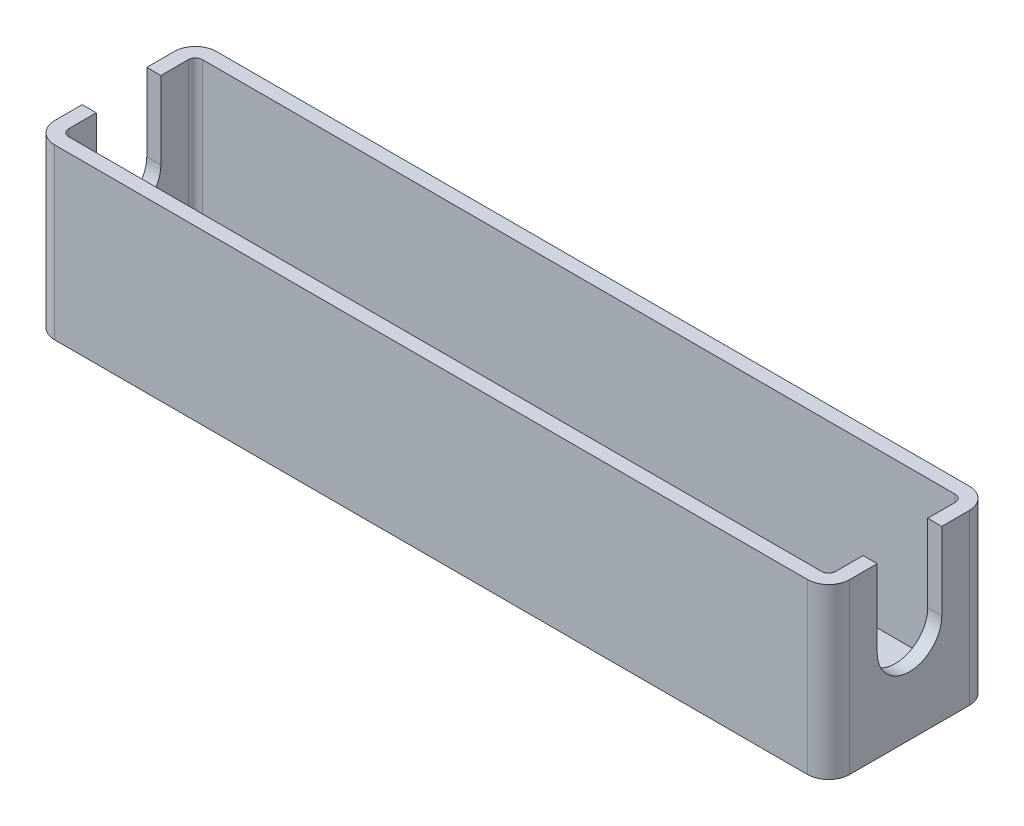
ISO-10303-21;
HEADER;
FILE_DESCRIPTION(('STEP AP214'),'2;1');
FILE_NAME('part.step','',(''),(''),'','','');
FILE_SCHEMA(('AUTOMOTIVE_DESIGN { 1 0 10303 214 1 1 1 1 }'));
ENDSEC;
DATA;
#1=APPLICATION_CONTEXT('core data for automotive mechanical design processes');
#2=APPLICATION_PROTOCOL_DEFINITION('international standard','automotive_design',2000,#1);
#3=PRODUCT_CONTEXT('',#1,'mechanical');
#4=PRODUCT('Part','Part','',(#3));
#5=PRODUCT_RELATED_PRODUCT_CATEGORY('part','',(#4));
#6=PRODUCT_DEFINITION_FORMATION('','',#4);
#7=PRODUCT_DEFINITION_CONTEXT('part definition',#1,'design');
#8=PRODUCT_DEFINITION('design','',#6,#7);
#9=PRODUCT_DEFINITION_SHAPE('','',#8);
#10=(LENGTH_UNIT() NAMED_UNIT(*) SI_UNIT(.MILLI.,.METRE.));
#11=(NAMED_UNIT(*) PLANE_ANGLE_UNIT() SI_UNIT($,.RADIAN.));
#12=(NAMED_UNIT(*) SI_UNIT($,.STERADIAN.) SOLID_ANGLE_UNIT());
#13=UNCERTAINTY_MEASURE_WITH_UNIT(LENGTH_MEASURE(1.E-05),#10,'distance_accuracy_value','');
#14=(GEOMETRIC_REPRESENTATION_CONTEXT(3) GLOBAL_UNCERTAINTY_ASSIGNED_CONTEXT((#13)) GLOBAL_UNIT_ASSIGNED_CONTEXT((#10,
#11,#12)) REPRESENTATION_CONTEXT('',''));
#15=CARTESIAN_POINT('',(0.,0.,0.));
#16=DIRECTION('',(0.,0.,1.));
#17=DIRECTION('',(1.,0.,0.));
#18=AXIS2_PLACEMENT_3D('',#15,#16,#17);
#19=CARTESIAN_POINT('',(-53.5,24.,-8.5));
#20=DIRECTION('',(0.,-1.,0.));
#21=DIRECTION('',(0.,0.,-1.));
#22=AXIS2_PLACEMENT_3D('',#19,#20,#21);
#23=PLANE('',#22);
#24=DIRECTION('',(0.,0.,1.));
#25=VECTOR('',#24,1.);
#26=CARTESIAN_POINT('',(-56.5,24.,8.49999999999998));
#27=LINE('',#26,#25);
#28=CARTESIAN_POINT('',(-56.5,24.,-8.49999999999998));
#29=VERTEX_POINT('',#28);
#30=CARTESIAN_POINT('',(-56.5,24.,-4.58880441680698));
#31=VERTEX_POINT('',#30);
#32=EDGE_CURVE('E231',#29,#31,#27,.T.);
#33=ORIENTED_EDGE('',*,*,#32,.T.);
#34=DIRECTION('',(1.,0.,0.));
#35=VECTOR('',#34,1.);
#36=CARTESIAN_POINT('',(-56.5,24.,-4.58880441680698));
#37=LINE('',#36,#35);
#38=CARTESIAN_POINT('',(-54.5,24.,-4.58880441680698));
#39=VERTEX_POINT('',#38);
#40=EDGE_CURVE('E350',#31,#39,#37,.T.);
#41=ORIENTED_EDGE('',*,*,#40,.T.);
#42=DIRECTION('',(0.,0.,1.));
#43=VECTOR('',#42,1.);
#44=CARTESIAN_POINT('',(-54.5,24.,-8.5));
#45=LINE('',#44,#43);
#46=CARTESIAN_POINT('',(-54.5,24.,-8.49999999999998));
#47=VERTEX_POINT('',#46);
#48=EDGE_CURVE('E416',#47,#39,#45,.T.);
#49=ORIENTED_EDGE('',*,*,#48,.F.);
#50=CARTESIAN_POINT('',(-53.5,24.,-8.5));
#51=DIRECTION('',(0.,-1.,0.));
#52=DIRECTION('',(0.,0.,-1.));
#53=AXIS2_PLACEMENT_3D('',#50,#51,#52);
#54=CIRCLE('',#53,1.);
#55=CARTESIAN_POINT('',(-53.5,24.,-9.5));
#56=VERTEX_POINT('',#55);
#57=EDGE_CURVE('E413',#56,#47,#54,.F.);
#58=ORIENTED_EDGE('',*,*,#57,.F.);
#59=DIRECTION('',(-1.,0.,0.));
#60=VECTOR('',#59,1.);
#61=CARTESIAN_POINT('',(-53.5,24.,-9.5));
#62=LINE('',#61,#60);
#63=CARTESIAN_POINT('',(53.5,24.,-9.50000000000001));
#64=VERTEX_POINT('',#63);
#65=EDGE_CURVE('E370',#64,#56,#62,.T.);
#66=ORIENTED_EDGE('',*,*,#65,.F.);
#67=CARTESIAN_POINT('',(53.5,24.,-8.5));
#68=DIRECTION('',(0.,-1.,0.));
#69=DIRECTION('',(0.,0.,-1.));
#70=AXIS2_PLACEMENT_3D('',#67,#68,#69);
#71=CIRCLE('',#70,1.);
#72=CARTESIAN_POINT('',(54.5,24.,-8.49999999999999));
#73=VERTEX_POINT('',#72);
#74=EDGE_CURVE('E432',#73,#64,#71,.F.);
#75=ORIENTED_EDGE('',*,*,#74,.F.);
#76=DIRECTION('',(0.,0.,-1.));
#77=VECTOR('',#76,1.);
#78=CARTESIAN_POINT('',(54.5,24.,-8.5));
#79=LINE('',#78,#77);
#80=CARTESIAN_POINT('',(54.5,24.,-4.58880441680698));
#81=VERTEX_POINT('',#80);
#82=EDGE_CURVE('E429',#81,#73,#79,.T.);
#83=ORIENTED_EDGE('',*,*,#82,.F.);
#84=CARTESIAN_POINT('',(56.5,24.,-4.58880441680698));
#85=VERTEX_POINT('',#84);
#86=EDGE_CURVE('E463',#81,#85,#37,.T.);
#87=ORIENTED_EDGE('',*,*,#86,.T.);
#88=DIRECTION('',(0.,0.,-1.));
#89=VECTOR('',#88,1.);
#90=CARTESIAN_POINT('',(56.5,24.,8.49999999999998));
#91=LINE('',#90,#89);
#92=CARTESIAN_POINT('',(56.5,24.,-8.49999999999998));
#93=VERTEX_POINT('',#92);
#94=EDGE_CURVE('E251',#85,#93,#91,.T.);
#95=ORIENTED_EDGE('',*,*,#94,.T.);
#96=CARTESIAN_POINT('',(53.5,24.,-8.5));
#97=DIRECTION('',(0.,1.,0.));
#98=DIRECTION('',(0.,0.,-1.));
#99=AXIS2_PLACEMENT_3D('',#96,#97,#98);
#100=CIRCLE('',#99,3.);
#101=CARTESIAN_POINT('',(53.5,24.,-11.5));
#102=VERTEX_POINT('',#101);
#103=EDGE_CURVE('E255',#93,#102,#100,.T.);
#104=ORIENTED_EDGE('',*,*,#103,.T.);
#105=DIRECTION('',(-1.,0.,0.));
#106=VECTOR('',#105,1.);
#107=CARTESIAN_POINT('',(-53.5,24.,-11.5));
#108=LINE('',#107,#106);
#109=CARTESIAN_POINT('',(-53.5,24.,-11.5));
#110=VERTEX_POINT('',#109);
#111=EDGE_CURVE('E258',#102,#110,#108,.T.);
#112=ORIENTED_EDGE('',*,*,#111,.T.);
#113=CARTESIAN_POINT('',(-53.5,24.,-8.5));
#114=DIRECTION('',(0.,1.,0.));
#115=DIRECTION('',(0.,0.,-1.));
#116=AXIS2_PLACEMENT_3D('',#113,#114,#115);
#117=CIRCLE('',#116,3.);
#118=EDGE_CURVE('E232',#110,#29,#117,.T.);
#119=ORIENTED_EDGE('',*,*,#118,.T.);
#120=EDGE_LOOP('',(#33,#41,#49,#58,#66,#75,#83,#87,#95,#104,#112,#119));
#121=FACE_BOUND('',#120,.T.);
#122=ADVANCED_FACE('F44',(#121),#23,.F.);
#123=CARTESIAN_POINT('',(56.5,24.,8.49999999999998));
#124=VERTEX_POINT('',#123);
#125=CARTESIAN_POINT('',(56.5,24.,4.58880441680698));
#126=VERTEX_POINT('',#125);
#127=EDGE_CURVE('E252',#124,#126,#91,.T.);
#128=ORIENTED_EDGE('',*,*,#127,.T.);
#129=DIRECTION('',(1.,0.,0.));
#130=VECTOR('',#129,1.);
#131=CARTESIAN_POINT('',(-56.5,24.,4.58880441680698));
#132=LINE('',#131,#130);
#133=CARTESIAN_POINT('',(54.5,24.,4.58880441680698));
#134=VERTEX_POINT('',#133);
#135=EDGE_CURVE('E224',#134,#126,#132,.T.);
#136=ORIENTED_EDGE('',*,*,#135,.F.);
#137=CARTESIAN_POINT('',(54.5,24.,8.49999999999999));
#138=VERTEX_POINT('',#137);
#139=EDGE_CURVE('E332',#138,#134,#79,.T.);
#140=ORIENTED_EDGE('',*,*,#139,.F.);
#141=CARTESIAN_POINT('',(53.5,24.,8.5));
#142=DIRECTION('',(0.,-1.,0.));
#143=DIRECTION('',(0.,0.,-1.));
#144=AXIS2_PLACEMENT_3D('',#141,#142,#143);
#145=CIRCLE('',#144,1.);
#146=CARTESIAN_POINT('',(53.5,24.,9.5));
#147=VERTEX_POINT('',#146);
#148=EDGE_CURVE('E426',#147,#138,#145,.F.);
#149=ORIENTED_EDGE('',*,*,#148,.F.);
#150=DIRECTION('',(1.,0.,0.));
#151=VECTOR('',#150,1.);
#152=CARTESIAN_POINT('',(-53.5,24.,9.5));
#153=LINE('',#152,#151);
#154=CARTESIAN_POINT('',(-53.5,24.,9.5));
#155=VERTEX_POINT('',#154);
#156=EDGE_CURVE('E423',#155,#147,#153,.T.);
#157=ORIENTED_EDGE('',*,*,#156,.F.);
#158=CARTESIAN_POINT('',(-53.5,24.,8.5));
#159=DIRECTION('',(0.,-1.,0.));
#160=DIRECTION('',(0.,0.,-1.));
#161=AXIS2_PLACEMENT_3D('',#158,#159,#160);
#162=CIRCLE('',#161,1.);
#163=CARTESIAN_POINT('',(-54.5,24.,8.49999999999998));
#164=VERTEX_POINT('',#163);
#165=EDGE_CURVE('E420',#164,#155,#162,.F.);
#166=ORIENTED_EDGE('',*,*,#165,.F.);
#167=CARTESIAN_POINT('',(-54.5,24.,4.58880441680698));
#168=VERTEX_POINT('',#167);
#169=EDGE_CURVE('E222',#168,#164,#45,.T.);
#170=ORIENTED_EDGE('',*,*,#169,.F.);
#171=CARTESIAN_POINT('',(-56.5,24.,4.58880441680698));
#172=VERTEX_POINT('',#171);
#173=EDGE_CURVE('E60',#172,#168,#132,.T.);
#174=ORIENTED_EDGE('',*,*,#173,.F.);
#175=CARTESIAN_POINT('',(-56.5,24.,8.49999999999998));
#176=VERTEX_POINT('',#175);
#177=EDGE_CURVE('E219',#172,#176,#27,.T.);
#178=ORIENTED_EDGE('',*,*,#177,.T.);
#179=CARTESIAN_POINT('',(-53.5,24.,8.5));
#180=DIRECTION('',(0.,1.,0.));
#181=DIRECTION('',(0.,0.,-1.));
#182=AXIS2_PLACEMENT_3D('',#179,#180,#181);
#183=CIRCLE('',#182,3.);
#184=CARTESIAN_POINT('',(-53.5,24.,11.5));
#185=VERTEX_POINT('',#184);
#186=EDGE_CURVE('E237',#176,#185,#183,.T.);
#187=ORIENTED_EDGE('',*,*,#186,.T.);
#188=DIRECTION('',(1.,0.,0.));
#189=VECTOR('',#188,1.);
#190=CARTESIAN_POINT('',(-53.5,24.,11.5));
#191=LINE('',#190,#189);
#192=CARTESIAN_POINT('',(53.5,24.,11.5));
#193=VERTEX_POINT('',#192);
#194=EDGE_CURVE('E245',#185,#193,#191,.T.);
#195=ORIENTED_EDGE('',*,*,#194,.T.);
#196=CARTESIAN_POINT('',(53.5,24.,8.5));
#197=DIRECTION('',(0.,1.,0.));
#198=DIRECTION('',(0.,0.,1.));
#199=AXIS2_PLACEMENT_3D('',#196,#197,#198);
#200=CIRCLE('',#199,3.);
#201=EDGE_CURVE('E248',#193,#124,#200,.T.);
#202=ORIENTED_EDGE('',*,*,#201,.T.);
#203=EDGE_LOOP('',(#128,#136,#140,#149,#157,#166,#170,#174,#178,#187,#195,#202));
#204=FACE_BOUND('',#203,.T.);
#205=ADVANCED_FACE('F218',(#204),#23,.F.);
#206=CARTESIAN_POINT('',(-53.5,24.,-8.5));
#207=DIRECTION('',(0.,-1.,0.));
#208=DIRECTION('',(0.,0.,-1.));
#209=AXIS2_PLACEMENT_3D('',#206,#207,#208);
#210=CYLINDRICAL_SURFACE('',#209,3.);
#211=CARTESIAN_POINT('',(-53.5,0.,-8.5));
#212=DIRECTION('',(0.,1.,0.));
#213=DIRECTION('',(0.,0.,-1.));
#214=AXIS2_PLACEMENT_3D('',#211,#212,#213);
#215=CIRCLE('',#214,3.);
#216=CARTESIAN_POINT('',(-53.5,0.,-11.5));
#217=VERTEX_POINT('',#216);
#218=CARTESIAN_POINT('',(-56.5,0.,-8.49999999999998));
#219=VERTEX_POINT('',#218);
#220=EDGE_CURVE('E262',#217,#219,#215,.T.);
#221=ORIENTED_EDGE('',*,*,#220,.T.);
#222=DIRECTION('',(0.,-1.,0.));
#223=VECTOR('',#222,1.);
#224=CARTESIAN_POINT('',(-56.5,24.,-8.49999999999998));
#225=LINE('',#224,#223);
#226=EDGE_CURVE('E312',#29,#219,#225,.T.);
#227=ORIENTED_EDGE('',*,*,#226,.F.);
#228=ORIENTED_EDGE('',*,*,#118,.F.);
#229=DIRECTION('',(0.,-1.,0.));
#230=VECTOR('',#229,1.);
#231=CARTESIAN_POINT('',(-53.5,24.,-11.5));
#232=LINE('',#231,#230);
#233=EDGE_CURVE('E261',#110,#217,#232,.T.);
#234=ORIENTED_EDGE('',*,*,#233,.T.);
#235=EDGE_LOOP('',(#221,#227,#228,#234));
#236=FACE_BOUND('',#235,.T.);
#237=ADVANCED_FACE('F46',(#236),#210,.T.);
#238=CARTESIAN_POINT('',(-56.5,24.,8.49999999999998));
#239=DIRECTION('',(1.,0.,0.));
#240=DIRECTION('',(0.,0.,-1.));
#241=AXIS2_PLACEMENT_3D('',#238,#239,#240);
#242=PLANE('',#241);
#243=CARTESIAN_POINT('',(-56.5,13.,0.));
#244=DIRECTION('',(1.,0.,0.));
#245=DIRECTION('',(0.,0.,-1.));
#246=AXIS2_PLACEMENT_3D('',#243,#244,#245);
#247=CIRCLE('',#246,4.58880441680698);
#248=CARTESIAN_POINT('',(-56.5,13.,4.58880441680698));
#249=VERTEX_POINT('',#248);
#250=CARTESIAN_POINT('',(-56.5,13.,-4.58880441680698));
#251=VERTEX_POINT('',#250);
#252=EDGE_CURVE('E212',#249,#251,#247,.T.);
#253=ORIENTED_EDGE('',*,*,#252,.T.);
#254=DIRECTION('',(0.,1.,0.));
#255=VECTOR('',#254,1.);
#256=CARTESIAN_POINT('',(-56.5,13.,-4.58880441680699));
#257=LINE('',#256,#255);
#258=EDGE_CURVE('E339',#251,#31,#257,.T.);
#259=ORIENTED_EDGE('',*,*,#258,.T.);
#260=ORIENTED_EDGE('',*,*,#32,.F.);
#261=ORIENTED_EDGE('',*,*,#226,.T.);
#262=DIRECTION('',(0.,0.,1.));
#263=VECTOR('',#262,1.);
#264=CARTESIAN_POINT('',(-56.5,0.,8.49999999999998));
#265=LINE('',#264,#263);
#266=CARTESIAN_POINT('',(-56.5,0.,8.49999999999998));
#267=VERTEX_POINT('',#266);
#268=EDGE_CURVE('E266',#219,#267,#265,.T.);
#269=ORIENTED_EDGE('',*,*,#268,.T.);
#270=DIRECTION('',(0.,-1.,0.));
#271=VECTOR('',#270,1.);
#272=CARTESIAN_POINT('',(-56.5,24.,8.49999999999998));
#273=LINE('',#272,#271);
#274=EDGE_CURVE('E228',#176,#267,#273,.T.);
#275=ORIENTED_EDGE('',*,*,#274,.F.);
#276=ORIENTED_EDGE('',*,*,#177,.F.);
#277=DIRECTION('',(0.,-1.,0.));
#278=VECTOR('',#277,1.);
#279=CARTESIAN_POINT('',(-56.5,24.,4.58880441680698));
#280=LINE('',#279,#278);
#281=EDGE_CURVE('E203',#172,#249,#280,.T.);
#282=ORIENTED_EDGE('',*,*,#281,.T.);
#283=EDGE_LOOP('',(#253,#259,#260,#261,#269,#275,#276,#282));
#284=FACE_BOUND('',#283,.T.);
#285=ADVANCED_FACE('F226',(#284),#242,.F.);
#286=CARTESIAN_POINT('',(-53.5,24.,8.5));
#287=DIRECTION('',(0.,-1.,0.));
#288=DIRECTION('',(0.,0.,-1.));
#289=AXIS2_PLACEMENT_3D('',#286,#287,#288);
#290=CYLINDRICAL_SURFACE('',#289,3.);
#291=CARTESIAN_POINT('',(-53.5,0.,8.5));
#292=DIRECTION('',(0.,1.,0.));
#293=DIRECTION('',(0.,0.,-1.));
#294=AXIS2_PLACEMENT_3D('',#291,#292,#293);
#295=CIRCLE('',#294,3.);
#296=CARTESIAN_POINT('',(-53.5,0.,11.5));
#297=VERTEX_POINT('',#296);
#298=EDGE_CURVE('E270',#267,#297,#295,.T.);
#299=ORIENTED_EDGE('',*,*,#298,.T.);
#300=DIRECTION('',(0.,-1.,0.));
#301=VECTOR('',#300,1.);
#302=CARTESIAN_POINT('',(-53.5,24.,11.5));
#303=LINE('',#302,#301);
#304=EDGE_CURVE('E306',#185,#297,#303,.T.);
#305=ORIENTED_EDGE('',*,*,#304,.F.);
#306=ORIENTED_EDGE('',*,*,#186,.F.);
#307=ORIENTED_EDGE('',*,*,#274,.T.);
#308=EDGE_LOOP('',(#299,#305,#306,#307));
#309=FACE_BOUND('',#308,.T.);
#310=ADVANCED_FACE('F532',(#309),#290,.T.);
#311=CARTESIAN_POINT('',(-53.5,24.,11.5));
#312=DIRECTION('',(0.,0.,-1.));
#313=DIRECTION('',(-1.,0.,0.));
#314=AXIS2_PLACEMENT_3D('',#311,#312,#313);
#315=PLANE('',#314);
#316=DIRECTION('',(1.,0.,0.));
#317=VECTOR('',#316,1.);
#318=CARTESIAN_POINT('',(-53.5,0.,11.5));
#319=LINE('',#318,#317);
#320=CARTESIAN_POINT('',(53.5,0.,11.5));
#321=VERTEX_POINT('',#320);
#322=EDGE_CURVE('E273',#297,#321,#319,.T.);
#323=ORIENTED_EDGE('',*,*,#322,.T.);
#324=DIRECTION('',(0.,-1.,0.));
#325=VECTOR('',#324,1.);
#326=CARTESIAN_POINT('',(53.5,24.,11.5));
#327=LINE('',#326,#325);
#328=EDGE_CURVE('E302',#193,#321,#327,.T.);
#329=ORIENTED_EDGE('',*,*,#328,.F.);
#330=ORIENTED_EDGE('',*,*,#194,.F.);
#331=ORIENTED_EDGE('',*,*,#304,.T.);
#332=EDGE_LOOP('',(#323,#329,#330,#331));
#333=FACE_BOUND('',#332,.T.);
#334=ADVANCED_FACE('F528',(#333),#315,.F.);
#335=CARTESIAN_POINT('',(53.5,24.,8.5));
#336=DIRECTION('',(0.,-1.,0.));
#337=DIRECTION('',(0.,0.,-1.));
#338=AXIS2_PLACEMENT_3D('',#335,#336,#337);
#339=CYLINDRICAL_SURFACE('',#338,3.);
#340=CARTESIAN_POINT('',(53.5,0.,8.5));
#341=DIRECTION('',(0.,1.,0.));
#342=DIRECTION('',(0.,0.,1.));
#343=AXIS2_PLACEMENT_3D('',#340,#341,#342);
#344=CIRCLE('',#343,3.);
#345=CARTESIAN_POINT('',(56.5,0.,8.49999999999998));
#346=VERTEX_POINT('',#345);
#347=EDGE_CURVE('E276',#321,#346,#344,.T.);
#348=ORIENTED_EDGE('',*,*,#347,.T.);
#349=DIRECTION('',(0.,-1.,0.));
#350=VECTOR('',#349,1.);
#351=CARTESIAN_POINT('',(56.5,24.,8.49999999999998));
#352=LINE('',#351,#350);
#353=EDGE_CURVE('E298',#124,#346,#352,.T.);
#354=ORIENTED_EDGE('',*,*,#353,.F.);
#355=ORIENTED_EDGE('',*,*,#201,.F.);
#356=ORIENTED_EDGE('',*,*,#328,.T.);
#357=EDGE_LOOP('',(#348,#354,#355,#356));
#358=FACE_BOUND('',#357,.T.);
#359=ADVANCED_FACE('F524',(#358),#339,.T.);
#360=CARTESIAN_POINT('',(56.5,24.,8.49999999999998));
#361=DIRECTION('',(-1.,0.,0.));
#362=DIRECTION('',(0.,0.,1.));
#363=AXIS2_PLACEMENT_3D('',#360,#361,#362);
#364=PLANE('',#363);
#365=ORIENTED_EDGE('',*,*,#94,.F.);
#366=DIRECTION('',(0.,1.,0.));
#367=VECTOR('',#366,1.);
#368=CARTESIAN_POINT('',(56.5,13.,-4.58880441680699));
#369=LINE('',#368,#367);
#370=CARTESIAN_POINT('',(56.5,13.,-4.58880441680698));
#371=VERTEX_POINT('',#370);
#372=EDGE_CURVE('E213',#371,#85,#369,.T.);
#373=ORIENTED_EDGE('',*,*,#372,.F.);
#374=CARTESIAN_POINT('',(56.5,13.,0.));
#375=DIRECTION('',(1.,0.,0.));
#376=DIRECTION('',(0.,0.,-1.));
#377=AXIS2_PLACEMENT_3D('',#374,#375,#376);
#378=CIRCLE('',#377,4.58880441680698);
#379=CARTESIAN_POINT('',(56.5,13.,4.58880441680698));
#380=VERTEX_POINT('',#379);
#381=EDGE_CURVE('E566',#380,#371,#378,.T.);
#382=ORIENTED_EDGE('',*,*,#381,.F.);
#383=DIRECTION('',(0.,-1.,0.));
#384=VECTOR('',#383,1.);
#385=CARTESIAN_POINT('',(56.5,24.,4.58880441680698));
#386=LINE('',#385,#384);
#387=EDGE_CURVE('E564',#126,#380,#386,.T.);
#388=ORIENTED_EDGE('',*,*,#387,.F.);
#389=ORIENTED_EDGE('',*,*,#127,.F.);
#390=ORIENTED_EDGE('',*,*,#353,.T.);
#391=DIRECTION('',(0.,0.,-1.));
#392=VECTOR('',#391,1.);
#393=CARTESIAN_POINT('',(56.5,0.,8.49999999999998));
#394=LINE('',#393,#392);
#395=CARTESIAN_POINT('',(56.5,0.,-8.49999999999998));
#396=VERTEX_POINT('',#395);
#397=EDGE_CURVE('E279',#346,#396,#394,.T.);
#398=ORIENTED_EDGE('',*,*,#397,.T.);
#399=DIRECTION('',(0.,-1.,0.));
#400=VECTOR('',#399,1.);
#401=CARTESIAN_POINT('',(56.5,24.,-8.49999999999998));
#402=LINE('',#401,#400);
#403=EDGE_CURVE('E294',#93,#396,#402,.T.);
#404=ORIENTED_EDGE('',*,*,#403,.F.);
#405=EDGE_LOOP('',(#365,#373,#382,#388,#389,#390,#398,#404));
#406=FACE_BOUND('',#405,.T.);
#407=ADVANCED_FACE('F520',(#406),#364,.F.);
#408=CARTESIAN_POINT('',(53.5,24.,-8.5));
#409=DIRECTION('',(0.,-1.,0.));
#410=DIRECTION('',(0.,0.,-1.));
#411=AXIS2_PLACEMENT_3D('',#408,#409,#410);
#412=CYLINDRICAL_SURFACE('',#411,3.);
#413=CARTESIAN_POINT('',(53.5,0.,-8.5));
#414=DIRECTION('',(0.,1.,0.));
#415=DIRECTION('',(0.,0.,-1.));
#416=AXIS2_PLACEMENT_3D('',#413,#414,#415);
#417=CIRCLE('',#416,3.);
#418=CARTESIAN_POINT('',(53.5,0.,-11.5));
#419=VERTEX_POINT('',#418);
#420=EDGE_CURVE('E282',#396,#419,#417,.T.);
#421=ORIENTED_EDGE('',*,*,#420,.T.);
#422=DIRECTION('',(0.,-1.,0.));
#423=VECTOR('',#422,1.);
#424=CARTESIAN_POINT('',(53.5,24.,-11.5));
#425=LINE('',#424,#423);
#426=EDGE_CURVE('E290',#102,#419,#425,.T.);
#427=ORIENTED_EDGE('',*,*,#426,.F.);
#428=ORIENTED_EDGE('',*,*,#103,.F.);
#429=ORIENTED_EDGE('',*,*,#403,.T.);
#430=EDGE_LOOP('',(#421,#427,#428,#429));
#431=FACE_BOUND('',#430,.T.);
#432=ADVANCED_FACE('F516',(#431),#412,.T.);
#433=CARTESIAN_POINT('',(-53.5,24.,-11.5));
#434=DIRECTION('',(0.,0.,1.));
#435=DIRECTION('',(1.,0.,0.));
#436=AXIS2_PLACEMENT_3D('',#433,#434,#435);
#437=PLANE('',#436);
#438=DIRECTION('',(-1.,0.,0.));
#439=VECTOR('',#438,1.);
#440=CARTESIAN_POINT('',(-53.5,0.,-11.5));
#441=LINE('',#440,#439);
#442=EDGE_CURVE('E239',#419,#217,#441,.T.);
#443=ORIENTED_EDGE('',*,*,#442,.T.);
#444=ORIENTED_EDGE('',*,*,#233,.F.);
#445=ORIENTED_EDGE('',*,*,#111,.F.);
#446=ORIENTED_EDGE('',*,*,#426,.T.);
#447=EDGE_LOOP('',(#443,#444,#445,#446));
#448=FACE_BOUND('',#447,.T.);
#449=ADVANCED_FACE('F512',(#448),#437,.F.);
#450=CARTESIAN_POINT('',(-53.5,0.,-8.5));
#451=DIRECTION('',(0.,-1.,0.));
#452=DIRECTION('',(0.,0.,-1.));
#453=AXIS2_PLACEMENT_3D('',#450,#451,#452);
#454=PLANE('',#453);
#455=ORIENTED_EDGE('',*,*,#220,.F.);
#456=ORIENTED_EDGE('',*,*,#442,.F.);
#457=ORIENTED_EDGE('',*,*,#420,.F.);
#458=ORIENTED_EDGE('',*,*,#397,.F.);
#459=ORIENTED_EDGE('',*,*,#347,.F.);
#460=ORIENTED_EDGE('',*,*,#322,.F.);
#461=ORIENTED_EDGE('',*,*,#298,.F.);
#462=ORIENTED_EDGE('',*,*,#268,.F.);
#463=EDGE_LOOP('',(#455,#456,#457,#458,#459,#460,#461,#462));
#464=FACE_BOUND('',#463,.T.);
#465=ADVANCED_FACE('F509',(#464),#454,.T.);
#466=CARTESIAN_POINT('',(-53.5,24.,-8.5));
#467=DIRECTION('',(0.,-1.,0.));
#468=DIRECTION('',(0.,0.,-1.));
#469=AXIS2_PLACEMENT_3D('',#466,#467,#468);
#470=CYLINDRICAL_SURFACE('',#469,1.);
#471=CARTESIAN_POINT('',(-53.5,2.,-8.5));
#472=DIRECTION('',(0.,-1.,0.));
#473=DIRECTION('',(0.,0.,-1.));
#474=AXIS2_PLACEMENT_3D('',#471,#472,#473);
#475=CIRCLE('',#474,1.);
#476=CARTESIAN_POINT('',(-53.5,2.,-9.50000000000001));
#477=VERTEX_POINT('',#476);
#478=CARTESIAN_POINT('',(-54.5,2.,-8.49999999999998));
#479=VERTEX_POINT('',#478);
#480=EDGE_CURVE('E356',#477,#479,#475,.F.);
#481=ORIENTED_EDGE('',*,*,#480,.F.);
#482=DIRECTION('',(0.,-1.,0.));
#483=VECTOR('',#482,1.);
#484=CARTESIAN_POINT('',(-53.5,24.,-9.50000000000001));
#485=LINE('',#484,#483);
#486=EDGE_CURVE('E365',#56,#477,#485,.T.);
#487=ORIENTED_EDGE('',*,*,#486,.F.);
#488=ORIENTED_EDGE('',*,*,#57,.T.);
#489=DIRECTION('',(0.,1.,0.));
#490=VECTOR('',#489,1.);
#491=CARTESIAN_POINT('',(-54.5,24.,-8.49999999999998));
#492=LINE('',#491,#490);
#493=EDGE_CURVE('E267',#47,#479,#492,.F.);
#494=ORIENTED_EDGE('',*,*,#493,.T.);
#495=EDGE_LOOP('',(#481,#487,#488,#494));
#496=FACE_BOUND('',#495,.T.);
#497=ADVANCED_FACE('F446',(#496),#470,.F.);
#498=CARTESIAN_POINT('',(-54.5,24.,8.49999999999998));
#499=DIRECTION('',(1.,0.,0.));
#500=DIRECTION('',(0.,0.,-1.));
#501=AXIS2_PLACEMENT_3D('',#498,#499,#500);
#502=PLANE('',#501);
#503=DIRECTION('',(0.,1.,0.));
#504=VECTOR('',#503,1.);
#505=CARTESIAN_POINT('',(-54.5,24.,-4.58880441680698));
#506=LINE('',#505,#504);
#507=CARTESIAN_POINT('',(-54.5,13.,-4.58880441680698));
#508=VERTEX_POINT('',#507);
#509=EDGE_CURVE('E353',#508,#39,#506,.T.);
#510=ORIENTED_EDGE('',*,*,#509,.F.);
#511=CARTESIAN_POINT('',(-54.5,13.,0.));
#512=DIRECTION('',(1.,0.,0.));
#513=DIRECTION('',(0.,0.,-1.));
#514=AXIS2_PLACEMENT_3D('',#511,#512,#513);
#515=CIRCLE('',#514,4.58880441680698);
#516=CARTESIAN_POINT('',(-54.5,13.,4.58880441680698));
#517=VERTEX_POINT('',#516);
#518=EDGE_CURVE('E349',#517,#508,#515,.T.);
#519=ORIENTED_EDGE('',*,*,#518,.F.);
#520=DIRECTION('',(0.,-1.,0.));
#521=VECTOR('',#520,1.);
#522=CARTESIAN_POINT('',(-54.5,24.,4.58880441680698));
#523=LINE('',#522,#521);
#524=EDGE_CURVE('E346',#168,#517,#523,.T.);
#525=ORIENTED_EDGE('',*,*,#524,.F.);
#526=ORIENTED_EDGE('',*,*,#169,.T.);
#527=DIRECTION('',(0.,-1.,0.));
#528=VECTOR('',#527,1.);
#529=CARTESIAN_POINT('',(-54.5,24.,8.49999999999999));
#530=LINE('',#529,#528);
#531=CARTESIAN_POINT('',(-54.5,2.,8.49999999999999));
#532=VERTEX_POINT('',#531);
#533=EDGE_CURVE('E364',#164,#532,#530,.T.);
#534=ORIENTED_EDGE('',*,*,#533,.T.);
#535=DIRECTION('',(0.,0.,1.));
#536=VECTOR('',#535,1.);
#537=CARTESIAN_POINT('',(-54.5,2.,-8.5));
#538=LINE('',#537,#536);
#539=EDGE_CURVE('E360',#479,#532,#538,.T.);
#540=ORIENTED_EDGE('',*,*,#539,.F.);
#541=ORIENTED_EDGE('',*,*,#493,.F.);
#542=ORIENTED_EDGE('',*,*,#48,.T.);
#543=EDGE_LOOP('',(#510,#519,#525,#526,#534,#540,#541,#542));
#544=FACE_BOUND('',#543,.T.);
#545=ADVANCED_FACE('F452',(#544),#502,.T.);
#546=CARTESIAN_POINT('',(-53.5,24.,8.5));
#547=DIRECTION('',(0.,-1.,0.));
#548=DIRECTION('',(0.,0.,-1.));
#549=AXIS2_PLACEMENT_3D('',#546,#547,#548);
#550=CYLINDRICAL_SURFACE('',#549,1.);
#551=CARTESIAN_POINT('',(-53.5,2.,8.5));
#552=DIRECTION('',(0.,-1.,0.));
#553=DIRECTION('',(0.,0.,-1.));
#554=AXIS2_PLACEMENT_3D('',#551,#552,#553);
#555=CIRCLE('',#554,1.);
#556=CARTESIAN_POINT('',(-53.5,2.,9.5));
#557=VERTEX_POINT('',#556);
#558=EDGE_CURVE('E373',#532,#557,#555,.F.);
#559=ORIENTED_EDGE('',*,*,#558,.F.);
#560=ORIENTED_EDGE('',*,*,#533,.F.);
#561=ORIENTED_EDGE('',*,*,#165,.T.);
#562=DIRECTION('',(0.,1.,0.));
#563=VECTOR('',#562,1.);
#564=CARTESIAN_POINT('',(-53.5,24.,9.5));
#565=LINE('',#564,#563);
#566=EDGE_CURVE('E377',#155,#557,#565,.F.);
#567=ORIENTED_EDGE('',*,*,#566,.T.);
#568=EDGE_LOOP('',(#559,#560,#561,#567));
#569=FACE_BOUND('',#568,.T.);
#570=ADVANCED_FACE('F481',(#569),#550,.F.);
#571=CARTESIAN_POINT('',(-53.5,24.,9.5));
#572=DIRECTION('',(0.,0.,-1.));
#573=DIRECTION('',(-1.,0.,0.));
#574=AXIS2_PLACEMENT_3D('',#571,#572,#573);
#575=PLANE('',#574);
#576=DIRECTION('',(1.,0.,0.));
#577=VECTOR('',#576,1.);
#578=CARTESIAN_POINT('',(-53.5,2.,9.5));
#579=LINE('',#578,#577);
#580=CARTESIAN_POINT('',(53.5,2.,9.5));
#581=VERTEX_POINT('',#580);
#582=EDGE_CURVE('E380',#557,#581,#579,.T.);
#583=ORIENTED_EDGE('',*,*,#582,.F.);
#584=ORIENTED_EDGE('',*,*,#566,.F.);
#585=ORIENTED_EDGE('',*,*,#156,.T.);
#586=DIRECTION('',(0.,-1.,0.));
#587=VECTOR('',#586,1.);
#588=CARTESIAN_POINT('',(53.5,24.,9.5));
#589=LINE('',#588,#587);
#590=EDGE_CURVE('E384',#147,#581,#589,.T.);
#591=ORIENTED_EDGE('',*,*,#590,.T.);
#592=EDGE_LOOP('',(#583,#584,#585,#591));
#593=FACE_BOUND('',#592,.T.);
#594=ADVANCED_FACE('F487',(#593),#575,.T.);
#595=CARTESIAN_POINT('',(53.5,24.,8.5));
#596=DIRECTION('',(0.,-1.,0.));
#597=DIRECTION('',(0.,0.,-1.));
#598=AXIS2_PLACEMENT_3D('',#595,#596,#597);
#599=CYLINDRICAL_SURFACE('',#598,1.);
#600=CARTESIAN_POINT('',(53.5,2.,8.5));
#601=DIRECTION('',(0.,-1.,0.));
#602=DIRECTION('',(0.,0.,-1.));
#603=AXIS2_PLACEMENT_3D('',#600,#601,#602);
#604=CIRCLE('',#603,1.);
#605=CARTESIAN_POINT('',(54.5,2.,8.49999999999998));
#606=VERTEX_POINT('',#605);
#607=EDGE_CURVE('E387',#581,#606,#604,.F.);
#608=ORIENTED_EDGE('',*,*,#607,.F.);
#609=ORIENTED_EDGE('',*,*,#590,.F.);
#610=ORIENTED_EDGE('',*,*,#148,.T.);
#611=DIRECTION('',(0.,1.,0.));
#612=VECTOR('',#611,1.);
#613=CARTESIAN_POINT('',(54.5,24.,8.49999999999998));
#614=LINE('',#613,#612);
#615=EDGE_CURVE('E391',#138,#606,#614,.F.);
#616=ORIENTED_EDGE('',*,*,#615,.T.);
#617=EDGE_LOOP('',(#608,#609,#610,#616));
#618=FACE_BOUND('',#617,.T.);
#619=ADVANCED_FACE('F490',(#618),#599,.F.);
#620=CARTESIAN_POINT('',(54.5,24.,8.49999999999998));
#621=DIRECTION('',(-1.,0.,0.));
#622=DIRECTION('',(0.,0.,1.));
#623=AXIS2_PLACEMENT_3D('',#620,#621,#622);
#624=PLANE('',#623);
#625=DIRECTION('',(0.,-1.,0.));
#626=VECTOR('',#625,1.);
#627=CARTESIAN_POINT('',(54.5,24.,-4.58880441680698));
#628=LINE('',#627,#626);
#629=CARTESIAN_POINT('',(54.5,13.,-4.58880441680698));
#630=VERTEX_POINT('',#629);
#631=EDGE_CURVE('E11',#81,#630,#628,.T.);
#632=ORIENTED_EDGE('',*,*,#631,.F.);
#633=ORIENTED_EDGE('',*,*,#82,.T.);
#634=DIRECTION('',(0.,-1.,0.));
#635=VECTOR('',#634,1.);
#636=CARTESIAN_POINT('',(54.5,24.,-8.5));
#637=LINE('',#636,#635);
#638=CARTESIAN_POINT('',(54.5,2.,-8.5));
#639=VERTEX_POINT('',#638);
#640=EDGE_CURVE('E398',#73,#639,#637,.T.);
#641=ORIENTED_EDGE('',*,*,#640,.T.);
#642=DIRECTION('',(0.,0.,-1.));
#643=VECTOR('',#642,1.);
#644=CARTESIAN_POINT('',(54.5,2.,-8.5));
#645=LINE('',#644,#643);
#646=EDGE_CURVE('E394',#606,#639,#645,.T.);
#647=ORIENTED_EDGE('',*,*,#646,.F.);
#648=ORIENTED_EDGE('',*,*,#615,.F.);
#649=ORIENTED_EDGE('',*,*,#139,.T.);
#650=DIRECTION('',(0.,1.,0.));
#651=VECTOR('',#650,1.);
#652=CARTESIAN_POINT('',(54.5,24.,4.58880441680698));
#653=LINE('',#652,#651);
#654=CARTESIAN_POINT('',(54.5,13.,4.58880441680698));
#655=VERTEX_POINT('',#654);
#656=EDGE_CURVE('E316',#655,#134,#653,.T.);
#657=ORIENTED_EDGE('',*,*,#656,.F.);
#658=CARTESIAN_POINT('',(54.5,13.,0.));
#659=DIRECTION('',(-1.,0.,0.));
#660=DIRECTION('',(0.,0.,1.));
#661=AXIS2_PLACEMENT_3D('',#658,#659,#660);
#662=CIRCLE('',#661,4.58880441680698);
#663=EDGE_CURVE('E53',#630,#655,#662,.T.);
#664=ORIENTED_EDGE('',*,*,#663,.F.);
#665=EDGE_LOOP('',(#632,#633,#641,#647,#648,#649,#657,#664));
#666=FACE_BOUND('',#665,.T.);
#667=ADVANCED_FACE('F329',(#666),#624,.T.);
#668=CARTESIAN_POINT('',(53.5,24.,-8.5));
#669=DIRECTION('',(0.,-1.,0.));
#670=DIRECTION('',(0.,0.,-1.));
#671=AXIS2_PLACEMENT_3D('',#668,#669,#670);
#672=CYLINDRICAL_SURFACE('',#671,1.);
#673=CARTESIAN_POINT('',(53.5,2.,-8.5));
#674=DIRECTION('',(0.,-1.,0.));
#675=DIRECTION('',(0.,0.,-1.));
#676=AXIS2_PLACEMENT_3D('',#673,#674,#675);
#677=CIRCLE('',#676,1.);
#678=CARTESIAN_POINT('',(53.5,2.,-9.5));
#679=VERTEX_POINT('',#678);
#680=EDGE_CURVE('E401',#639,#679,#677,.F.);
#681=ORIENTED_EDGE('',*,*,#680,.F.);
#682=ORIENTED_EDGE('',*,*,#640,.F.);
#683=ORIENTED_EDGE('',*,*,#74,.T.);
#684=DIRECTION('',(0.,1.,0.));
#685=VECTOR('',#684,1.);
#686=CARTESIAN_POINT('',(53.5,24.,-9.5));
#687=LINE('',#686,#685);
#688=EDGE_CURVE('E369',#64,#679,#687,.F.);
#689=ORIENTED_EDGE('',*,*,#688,.T.);
#690=EDGE_LOOP('',(#681,#682,#683,#689));
#691=FACE_BOUND('',#690,.T.);
#692=ADVANCED_FACE('F460',(#691),#672,.F.);
#693=CARTESIAN_POINT('',(-53.5,24.,-9.5));
#694=DIRECTION('',(0.,0.,1.));
#695=DIRECTION('',(1.,0.,0.));
#696=AXIS2_PLACEMENT_3D('',#693,#694,#695);
#697=PLANE('',#696);
#698=DIRECTION('',(-1.,0.,0.));
#699=VECTOR('',#698,1.);
#700=CARTESIAN_POINT('',(-53.5,2.,-9.5));
#701=LINE('',#700,#699);
#702=EDGE_CURVE('E407',#679,#477,#701,.T.);
#703=ORIENTED_EDGE('',*,*,#702,.F.);
#704=ORIENTED_EDGE('',*,*,#688,.F.);
#705=ORIENTED_EDGE('',*,*,#65,.T.);
#706=ORIENTED_EDGE('',*,*,#486,.T.);
#707=EDGE_LOOP('',(#703,#704,#705,#706));
#708=FACE_BOUND('',#707,.T.);
#709=ADVANCED_FACE('F440',(#708),#697,.T.);
#710=CARTESIAN_POINT('',(-53.5,2.,-8.5));
#711=DIRECTION('',(0.,-1.,0.));
#712=DIRECTION('',(0.,0.,-1.));
#713=AXIS2_PLACEMENT_3D('',#710,#711,#712);
#714=PLANE('',#713);
#715=ORIENTED_EDGE('',*,*,#480,.T.);
#716=ORIENTED_EDGE('',*,*,#539,.T.);
#717=ORIENTED_EDGE('',*,*,#558,.T.);
#718=ORIENTED_EDGE('',*,*,#582,.T.);
#719=ORIENTED_EDGE('',*,*,#607,.T.);
#720=ORIENTED_EDGE('',*,*,#646,.T.);
#721=ORIENTED_EDGE('',*,*,#680,.T.);
#722=ORIENTED_EDGE('',*,*,#702,.T.);
#723=EDGE_LOOP('',(#715,#716,#717,#718,#719,#720,#721,#722));
#724=FACE_BOUND('',#723,.T.);
#725=ADVANCED_FACE('F455',(#724),#714,.F.);
#726=CARTESIAN_POINT('',(-56.5,24.,4.58880441680698));
#727=DIRECTION('',(0.,0.,1.));
#728=DIRECTION('',(0.,-1.,0.));
#729=AXIS2_PLACEMENT_3D('',#726,#727,#728);
#730=PLANE('',#729);
#731=ORIENTED_EDGE('',*,*,#656,.T.);
#732=ORIENTED_EDGE('',*,*,#135,.T.);
#733=ORIENTED_EDGE('',*,*,#387,.T.);
#734=DIRECTION('',(1.,0.,0.));
#735=VECTOR('',#734,1.);
#736=CARTESIAN_POINT('',(-56.5,13.,4.58880441680698));
#737=LINE('',#736,#735);
#738=EDGE_CURVE('E68',#655,#380,#737,.T.);
#739=ORIENTED_EDGE('',*,*,#738,.F.);
#740=EDGE_LOOP('',(#731,#732,#733,#739));
#741=FACE_BOUND('',#740,.T.);
#742=ADVANCED_FACE('F334',(#741),#730,.F.);
#743=CARTESIAN_POINT('',(-56.5,13.,0.));
#744=DIRECTION('',(1.,0.,0.));
#745=DIRECTION('',(0.,0.,-1.));
#746=AXIS2_PLACEMENT_3D('',#743,#744,#745);
#747=CYLINDRICAL_SURFACE('',#746,4.58880441680698);
#748=ORIENTED_EDGE('',*,*,#663,.T.);
#749=ORIENTED_EDGE('',*,*,#738,.T.);
#750=ORIENTED_EDGE('',*,*,#381,.T.);
#751=DIRECTION('',(1.,0.,0.));
#752=VECTOR('',#751,1.);
#753=CARTESIAN_POINT('',(-56.5,13.,-4.58880441680698));
#754=LINE('',#753,#752);
#755=EDGE_CURVE('E325',#630,#371,#754,.T.);
#756=ORIENTED_EDGE('',*,*,#755,.F.);
#757=EDGE_LOOP('',(#748,#749,#750,#756));
#758=FACE_BOUND('',#757,.T.);
#759=ADVANCED_FACE('F323',(#758),#747,.F.);
#760=CARTESIAN_POINT('',(-56.5,13.,-4.58880441680699));
#761=DIRECTION('',(0.,0.,-1.));
#762=DIRECTION('',(0.,1.,0.));
#763=AXIS2_PLACEMENT_3D('',#760,#761,#762);
#764=PLANE('',#763);
#765=ORIENTED_EDGE('',*,*,#631,.T.);
#766=ORIENTED_EDGE('',*,*,#755,.T.);
#767=ORIENTED_EDGE('',*,*,#372,.T.);
#768=ORIENTED_EDGE('',*,*,#86,.F.);
#769=EDGE_LOOP('',(#765,#766,#767,#768));
#770=FACE_BOUND('',#769,.T.);
#771=ADVANCED_FACE('F575',(#770),#764,.F.);
#772=ORIENTED_EDGE('',*,*,#509,.T.);
#773=ORIENTED_EDGE('',*,*,#40,.F.);
#774=ORIENTED_EDGE('',*,*,#258,.F.);
#775=EDGE_CURVE('E471',#251,#508,#754,.T.);
#776=ORIENTED_EDGE('',*,*,#775,.T.);
#777=EDGE_LOOP('',(#772,#773,#774,#776));
#778=FACE_BOUND('',#777,.T.);
#779=ADVANCED_FACE('F578',(#778),#764,.F.);
#780=ORIENTED_EDGE('',*,*,#518,.T.);
#781=ORIENTED_EDGE('',*,*,#775,.F.);
#782=ORIENTED_EDGE('',*,*,#252,.F.);
#783=EDGE_CURVE('E206',#249,#517,#737,.T.);
#784=ORIENTED_EDGE('',*,*,#783,.T.);
#785=EDGE_LOOP('',(#780,#781,#782,#784));
#786=FACE_BOUND('',#785,.T.);
#787=ADVANCED_FACE('F477',(#786),#747,.F.);
#788=ORIENTED_EDGE('',*,*,#524,.T.);
#789=ORIENTED_EDGE('',*,*,#783,.F.);
#790=ORIENTED_EDGE('',*,*,#281,.F.);
#791=ORIENTED_EDGE('',*,*,#173,.T.);
#792=EDGE_LOOP('',(#788,#789,#790,#791));
#793=FACE_BOUND('',#792,.T.);
#794=ADVANCED_FACE('F204',(#793),#730,.F.);
#795=CLOSED_SHELL('',(#122,#205,#237,#285,#310,#334,#359,#407,#432,#449,#465,#497,#545,#570,
#594,#619,#667,#692,#709,#725,#742,#759,#771,#779,#787,#794));
#796=MANIFOLD_SOLID_BREP('B2',#795);
#797=ADVANCED_BREP_SHAPE_REPRESENTATION('',(#18,#796),#14);
#798=SHAPE_DEFINITION_REPRESENTATION(#9,#797);
ENDSEC;
END-ISO-10303-21;
